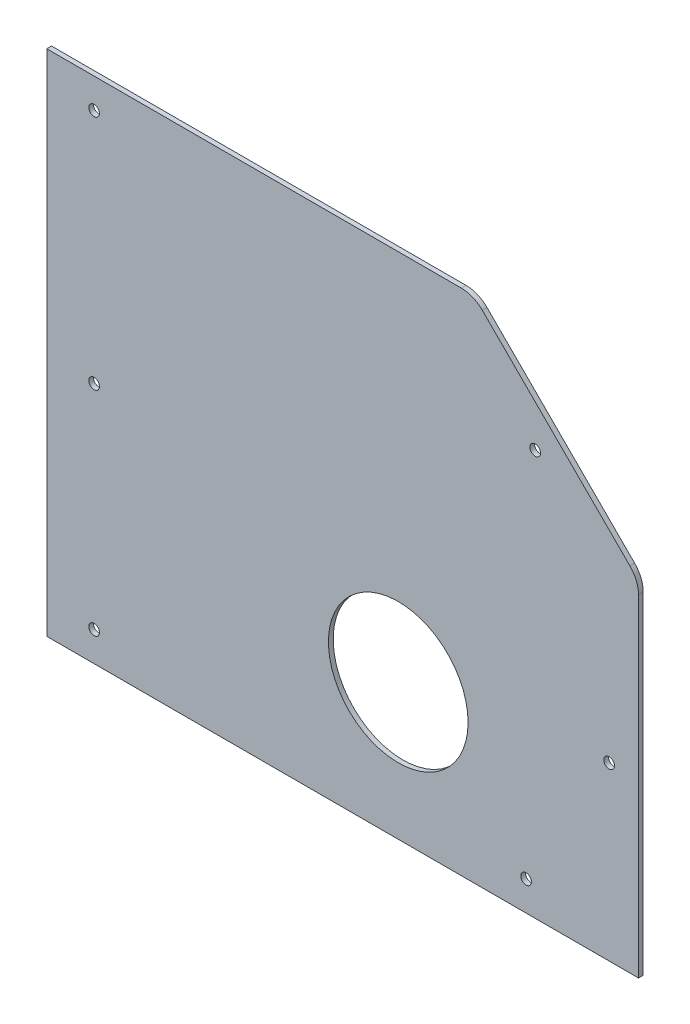
ISO-10303-21;
HEADER;
FILE_DESCRIPTION(('STEP AP214'),'2;1');
FILE_NAME('part.step','',(''),(''),'','','');
FILE_SCHEMA(('AUTOMOTIVE_DESIGN { 1 0 10303 214 1 1 1 1 }'));
ENDSEC;
DATA;
#1=APPLICATION_CONTEXT('core data for automotive mechanical design processes');
#2=APPLICATION_PROTOCOL_DEFINITION('international standard','automotive_design',2000,#1);
#3=PRODUCT_CONTEXT('',#1,'mechanical');
#4=PRODUCT('Part','Part','',(#3));
#5=PRODUCT_RELATED_PRODUCT_CATEGORY('part','',(#4));
#6=PRODUCT_DEFINITION_FORMATION('','',#4);
#7=PRODUCT_DEFINITION_CONTEXT('part definition',#1,'design');
#8=PRODUCT_DEFINITION('design','',#6,#7);
#9=PRODUCT_DEFINITION_SHAPE('','',#8);
#10=(LENGTH_UNIT() NAMED_UNIT(*) SI_UNIT(.MILLI.,.METRE.));
#11=(NAMED_UNIT(*) PLANE_ANGLE_UNIT() SI_UNIT($,.RADIAN.));
#12=(NAMED_UNIT(*) SI_UNIT($,.STERADIAN.) SOLID_ANGLE_UNIT());
#13=UNCERTAINTY_MEASURE_WITH_UNIT(LENGTH_MEASURE(1.E-05),#10,'distance_accuracy_value','');
#14=(GEOMETRIC_REPRESENTATION_CONTEXT(3) GLOBAL_UNCERTAINTY_ASSIGNED_CONTEXT((#13)) GLOBAL_UNIT_ASSIGNED_CONTEXT((#10,
#11,#12)) REPRESENTATION_CONTEXT('',''));
#15=CARTESIAN_POINT('',(0.,0.,0.));
#16=DIRECTION('',(0.,0.,1.));
#17=DIRECTION('',(1.,0.,0.));
#18=AXIS2_PLACEMENT_3D('',#15,#16,#17);
#19=CARTESIAN_POINT('',(-27.4222013243281,-109.999999999997,0.));
#20=DIRECTION('',(0.,0.,1.));
#21=DIRECTION('',(1.,0.,0.));
#22=AXIS2_PLACEMENT_3D('',#19,#20,#21);
#23=PLANE('',#22);
#24=CARTESIAN_POINT('',(-132.422201324328,-205.,0.));
#25=DIRECTION('',(0.,0.,-1.));
#26=DIRECTION('',(-1.,0.,0.));
#27=AXIS2_PLACEMENT_3D('',#24,#25,#26);
#28=CIRCLE('',#27,2.25);
#29=CARTESIAN_POINT('',(-130.172201324328,-205.,0.));
#30=VERTEX_POINT('',#29);
#31=EDGE_CURVE('E146',#30,#30,#28,.T.);
#32=ORIENTED_EDGE('',*,*,#31,.F.);
#33=EDGE_LOOP('',(#32));
#34=FACE_BOUND('',#33,.T.);
#35=CARTESIAN_POINT('',(50.0777986756719,-205.,0.));
#36=DIRECTION('',(0.,0.,-1.));
#37=DIRECTION('',(-1.,0.,0.));
#38=AXIS2_PLACEMENT_3D('',#35,#36,#37);
#39=CIRCLE('',#38,2.25);
#40=CARTESIAN_POINT('',(52.3277986756719,-205.,0.));
#41=VERTEX_POINT('',#40);
#42=EDGE_CURVE('E195',#41,#41,#39,.T.);
#43=ORIENTED_EDGE('',*,*,#42,.F.);
#44=EDGE_LOOP('',(#43));
#45=FACE_BOUND('',#44,.T.);
#46=CARTESIAN_POINT('',(-132.422201324328,-15.0939113089667,0.));
#47=DIRECTION('',(0.,0.,-1.));
#48=DIRECTION('',(-1.,0.,0.));
#49=AXIS2_PLACEMENT_3D('',#46,#47,#48);
#50=CIRCLE('',#49,2.25);
#51=CARTESIAN_POINT('',(-130.172201324328,-15.0939113089667,0.));
#52=VERTEX_POINT('',#51);
#53=EDGE_CURVE('E279',#52,#52,#50,.T.);
#54=ORIENTED_EDGE('',*,*,#53,.F.);
#55=EDGE_LOOP('',(#54));
#56=FACE_BOUND('',#55,.T.);
#57=CARTESIAN_POINT('',(53.9221084670488,-46.1836086897215,0.));
#58=DIRECTION('',(0.,0.,-1.));
#59=DIRECTION('',(-1.,0.,0.));
#60=AXIS2_PLACEMENT_3D('',#57,#58,#59);
#61=CIRCLE('',#60,2.25);
#62=CARTESIAN_POINT('',(56.1721084670488,-46.1836086897215,0.));
#63=VERTEX_POINT('',#62);
#64=EDGE_CURVE('E120',#63,#63,#61,.T.);
#65=ORIENTED_EDGE('',*,*,#64,.F.);
#66=EDGE_LOOP('',(#65));
#67=FACE_BOUND('',#66,.T.);
#68=CARTESIAN_POINT('',(-132.422201324328,-115.,0.));
#69=DIRECTION('',(0.,0.,-1.));
#70=DIRECTION('',(-1.,0.,0.));
#71=AXIS2_PLACEMENT_3D('',#68,#69,#70);
#72=CIRCLE('',#71,2.25);
#73=CARTESIAN_POINT('',(-130.172201324328,-115.,0.));
#74=VERTEX_POINT('',#73);
#75=EDGE_CURVE('E179',#74,#74,#72,.T.);
#76=ORIENTED_EDGE('',*,*,#75,.F.);
#77=EDGE_LOOP('',(#76));
#78=FACE_BOUND('',#77,.T.);
#79=CARTESIAN_POINT('',(-3.92220132432799,-160.,0.));
#80=DIRECTION('',(0.,0.,-1.));
#81=DIRECTION('',(-1.,0.,0.));
#82=AXIS2_PLACEMENT_3D('',#79,#80,#81);
#83=CIRCLE('',#82,29.5);
#84=CARTESIAN_POINT('',(25.577798675672,-160.,0.));
#85=VERTEX_POINT('',#84);
#86=EDGE_CURVE('E207',#85,#85,#83,.T.);
#87=ORIENTED_EDGE('',*,*,#86,.F.);
#88=EDGE_LOOP('',(#87));
#89=FACE_BOUND('',#88,.T.);
#90=CARTESIAN_POINT('',(85.1717099846429,-145.,0.));
#91=DIRECTION('',(0.,0.,-1.));
#92=DIRECTION('',(-1.,0.,0.));
#93=AXIS2_PLACEMENT_3D('',#90,#91,#92);
#94=CIRCLE('',#93,2.25);
#95=CARTESIAN_POINT('',(87.4217099846429,-145.,0.));
#96=VERTEX_POINT('',#95);
#97=EDGE_CURVE('E189',#96,#96,#94,.T.);
#98=ORIENTED_EDGE('',*,*,#97,.F.);
#99=EDGE_LOOP('',(#98));
#100=FACE_BOUND('',#99,.T.);
#101=DIRECTION('',(-1.,0.,0.));
#102=VECTOR('',#101,1.);
#103=CARTESIAN_POINT('',(22.6996581608176,-2.49999999999491,0.));
#104=LINE('',#103,#102);
#105=CARTESIAN_POINT('',(22.6996581608176,-2.49999999999491,0.));
#106=VERTEX_POINT('',#105);
#107=CARTESIAN_POINT('',(-152.422201324328,-2.49999999999474,0.));
#108=VERTEX_POINT('',#107);
#109=EDGE_CURVE('E26',#106,#108,#104,.T.);
#110=ORIENTED_EDGE('',*,*,#109,.F.);
#111=CARTESIAN_POINT('',(22.6996581608177,-15.0939113089667,0.));
#112=DIRECTION('',(0.,0.,1.));
#113=DIRECTION('',(0.707106781186548,0.707106781186547,0.));
#114=AXIS2_PLACEMENT_3D('',#111,#112,#113);
#115=CIRCLE('',#114,12.5939113089718);
#116=CARTESIAN_POINT('',(31.6048982490536,-6.18867122073081,0.));
#117=VERTEX_POINT('',#116);
#118=EDGE_CURVE('E173',#117,#106,#115,.T.);
#119=ORIENTED_EDGE('',*,*,#118,.F.);
#120=DIRECTION('',(-0.707106781186544,0.707106781186551,0.));
#121=VECTOR('',#120,1.);
#122=CARTESIAN_POINT('',(93.9441394260712,-68.5279123977498,0.));
#123=LINE('',#122,#121);
#124=CARTESIAN_POINT('',(93.9441394260712,-68.5279123977498,0.));
#125=VERTEX_POINT('',#124);
#126=EDGE_CURVE('E212',#125,#117,#123,.T.);
#127=ORIENTED_EDGE('',*,*,#126,.F.);
#128=CARTESIAN_POINT('',(85.1717099846428,-77.3003418391783,0.));
#129=DIRECTION('',(0.,0.,1.));
#130=DIRECTION('',(1.,0.,0.));
#131=AXIS2_PLACEMENT_3D('',#128,#129,#130);
#132=CIRCLE('',#131,12.4060886910291);
#133=CARTESIAN_POINT('',(97.5777986756719,-77.3003418391783,0.));
#134=VERTEX_POINT('',#133);
#135=EDGE_CURVE('E203',#134,#125,#132,.T.);
#136=ORIENTED_EDGE('',*,*,#135,.F.);
#137=DIRECTION('',(0.,1.,0.));
#138=VECTOR('',#137,1.);
#139=CARTESIAN_POINT('',(97.5777986756719,-217.5,0.));
#140=LINE('',#139,#138);
#141=CARTESIAN_POINT('',(97.5777986756719,-217.5,0.));
#142=VERTEX_POINT('',#141);
#143=EDGE_CURVE('E184',#142,#134,#140,.T.);
#144=ORIENTED_EDGE('',*,*,#143,.F.);
#145=DIRECTION('',(1.,0.,0.));
#146=VECTOR('',#145,1.);
#147=CARTESIAN_POINT('',(-619.922201324328,-217.5,0.));
#148=LINE('',#147,#146);
#149=CARTESIAN_POINT('',(-152.422201324328,-217.5,0.));
#150=VERTEX_POINT('',#149);
#151=EDGE_CURVE('E240',#150,#142,#148,.T.);
#152=ORIENTED_EDGE('',*,*,#151,.F.);
#153=DIRECTION('',(0.,-1.,0.));
#154=VECTOR('',#153,1.);
#155=CARTESIAN_POINT('',(-152.422201324328,-2.49999999999474,0.));
#156=LINE('',#155,#154);
#157=EDGE_CURVE('E271',#108,#150,#156,.T.);
#158=ORIENTED_EDGE('',*,*,#157,.F.);
#159=EDGE_LOOP('',(#110,#119,#127,#136,#144,#152,#158));
#160=FACE_BOUND('',#159,.T.);
#161=ADVANCED_FACE('F15',(#34,#45,#56,#67,#78,#89,#100,#160),#23,.F.);
#162=CARTESIAN_POINT('',(-27.4222013243281,-109.999999999997,2.));
#163=DIRECTION('',(0.,0.,1.));
#164=DIRECTION('',(1.,0.,0.));
#165=AXIS2_PLACEMENT_3D('',#162,#163,#164);
#166=PLANE('',#165);
#167=CARTESIAN_POINT('',(-132.422201324328,-205.,2.));
#168=DIRECTION('',(0.,0.,-1.));
#169=DIRECTION('',(-1.,0.,0.));
#170=AXIS2_PLACEMENT_3D('',#167,#168,#169);
#171=CIRCLE('',#170,2.25);
#172=CARTESIAN_POINT('',(-130.172201324328,-205.,2.));
#173=VERTEX_POINT('',#172);
#174=EDGE_CURVE('E153',#173,#173,#171,.T.);
#175=ORIENTED_EDGE('',*,*,#174,.T.);
#176=EDGE_LOOP('',(#175));
#177=FACE_BOUND('',#176,.T.);
#178=CARTESIAN_POINT('',(50.0777986756719,-205.,2.));
#179=DIRECTION('',(0.,0.,-1.));
#180=DIRECTION('',(-1.,0.,0.));
#181=AXIS2_PLACEMENT_3D('',#178,#179,#180);
#182=CIRCLE('',#181,2.25);
#183=CARTESIAN_POINT('',(52.3277986756719,-205.,2.));
#184=VERTEX_POINT('',#183);
#185=EDGE_CURVE('E190',#184,#184,#182,.T.);
#186=ORIENTED_EDGE('',*,*,#185,.T.);
#187=EDGE_LOOP('',(#186));
#188=FACE_BOUND('',#187,.T.);
#189=CARTESIAN_POINT('',(-132.422201324328,-15.0939113089667,2.));
#190=DIRECTION('',(0.,0.,-1.));
#191=DIRECTION('',(-1.,0.,0.));
#192=AXIS2_PLACEMENT_3D('',#189,#190,#191);
#193=CIRCLE('',#192,2.25);
#194=CARTESIAN_POINT('',(-130.172201324328,-15.0939113089667,2.));
#195=VERTEX_POINT('',#194);
#196=EDGE_CURVE('E198',#195,#195,#193,.T.);
#197=ORIENTED_EDGE('',*,*,#196,.T.);
#198=EDGE_LOOP('',(#197));
#199=FACE_BOUND('',#198,.T.);
#200=CARTESIAN_POINT('',(53.9221084670488,-46.1836086897215,2.));
#201=DIRECTION('',(0.,0.,-1.));
#202=DIRECTION('',(-1.,0.,0.));
#203=AXIS2_PLACEMENT_3D('',#200,#201,#202);
#204=CIRCLE('',#203,2.25);
#205=CARTESIAN_POINT('',(56.1721084670488,-46.1836086897215,2.));
#206=VERTEX_POINT('',#205);
#207=EDGE_CURVE('E282',#206,#206,#204,.T.);
#208=ORIENTED_EDGE('',*,*,#207,.T.);
#209=EDGE_LOOP('',(#208));
#210=FACE_BOUND('',#209,.T.);
#211=CARTESIAN_POINT('',(-132.422201324328,-115.,2.));
#212=DIRECTION('',(0.,0.,-1.));
#213=DIRECTION('',(-1.,0.,0.));
#214=AXIS2_PLACEMENT_3D('',#211,#212,#213);
#215=CIRCLE('',#214,2.25);
#216=CARTESIAN_POINT('',(-130.172201324328,-115.,2.));
#217=VERTEX_POINT('',#216);
#218=EDGE_CURVE('E247',#217,#217,#215,.T.);
#219=ORIENTED_EDGE('',*,*,#218,.T.);
#220=EDGE_LOOP('',(#219));
#221=FACE_BOUND('',#220,.T.);
#222=CARTESIAN_POINT('',(-3.92220132432799,-160.,2.));
#223=DIRECTION('',(0.,0.,-1.));
#224=DIRECTION('',(-1.,0.,0.));
#225=AXIS2_PLACEMENT_3D('',#222,#223,#224);
#226=CIRCLE('',#225,29.5);
#227=CARTESIAN_POINT('',(25.577798675672,-160.,2.));
#228=VERTEX_POINT('',#227);
#229=EDGE_CURVE('E174',#228,#228,#226,.T.);
#230=ORIENTED_EDGE('',*,*,#229,.T.);
#231=EDGE_LOOP('',(#230));
#232=FACE_BOUND('',#231,.T.);
#233=CARTESIAN_POINT('',(85.1717099846429,-145.,2.));
#234=DIRECTION('',(0.,0.,-1.));
#235=DIRECTION('',(-1.,0.,0.));
#236=AXIS2_PLACEMENT_3D('',#233,#234,#235);
#237=CIRCLE('',#236,2.25);
#238=CARTESIAN_POINT('',(87.4217099846429,-145.,2.));
#239=VERTEX_POINT('',#238);
#240=EDGE_CURVE('E166',#239,#239,#237,.T.);
#241=ORIENTED_EDGE('',*,*,#240,.T.);
#242=EDGE_LOOP('',(#241));
#243=FACE_BOUND('',#242,.T.);
#244=DIRECTION('',(-1.,0.,0.));
#245=VECTOR('',#244,1.);
#246=CARTESIAN_POINT('',(22.6996581608176,-2.49999999999491,2.));
#247=LINE('',#246,#245);
#248=CARTESIAN_POINT('',(22.6996581608176,-2.49999999999491,2.));
#249=VERTEX_POINT('',#248);
#250=CARTESIAN_POINT('',(-152.422201324328,-2.49999999999474,2.));
#251=VERTEX_POINT('',#250);
#252=EDGE_CURVE('E10',#249,#251,#247,.T.);
#253=ORIENTED_EDGE('',*,*,#252,.T.);
#254=DIRECTION('',(0.,-1.,0.));
#255=VECTOR('',#254,1.);
#256=CARTESIAN_POINT('',(-152.422201324328,-2.49999999999474,2.));
#257=LINE('',#256,#255);
#258=CARTESIAN_POINT('',(-152.422201324328,-217.5,2.));
#259=VERTEX_POINT('',#258);
#260=EDGE_CURVE('E268',#251,#259,#257,.T.);
#261=ORIENTED_EDGE('',*,*,#260,.T.);
#262=DIRECTION('',(1.,0.,0.));
#263=VECTOR('',#262,1.);
#264=CARTESIAN_POINT('',(-619.922201324328,-217.5,2.));
#265=LINE('',#264,#263);
#266=CARTESIAN_POINT('',(97.5777986756719,-217.5,2.));
#267=VERTEX_POINT('',#266);
#268=EDGE_CURVE('E261',#259,#267,#265,.T.);
#269=ORIENTED_EDGE('',*,*,#268,.T.);
#270=DIRECTION('',(0.,1.,0.));
#271=VECTOR('',#270,1.);
#272=CARTESIAN_POINT('',(97.5777986756719,-217.5,2.));
#273=LINE('',#272,#271);
#274=CARTESIAN_POINT('',(97.5777986756719,-77.3003418391783,2.));
#275=VERTEX_POINT('',#274);
#276=EDGE_CURVE('E241',#267,#275,#273,.T.);
#277=ORIENTED_EDGE('',*,*,#276,.T.);
#278=CARTESIAN_POINT('',(85.1717099846428,-77.3003418391783,2.));
#279=DIRECTION('',(0.,0.,1.));
#280=DIRECTION('',(1.,0.,0.));
#281=AXIS2_PLACEMENT_3D('',#278,#279,#280);
#282=CIRCLE('',#281,12.4060886910291);
#283=CARTESIAN_POINT('',(93.9441394260712,-68.5279123977498,2.));
#284=VERTEX_POINT('',#283);
#285=EDGE_CURVE('E185',#275,#284,#282,.T.);
#286=ORIENTED_EDGE('',*,*,#285,.T.);
#287=DIRECTION('',(-0.707106781186544,0.707106781186551,0.));
#288=VECTOR('',#287,1.);
#289=CARTESIAN_POINT('',(93.9441394260712,-68.5279123977498,2.));
#290=LINE('',#289,#288);
#291=CARTESIAN_POINT('',(31.6048982490536,-6.18867122073081,2.));
#292=VERTEX_POINT('',#291);
#293=EDGE_CURVE('E210',#284,#292,#290,.T.);
#294=ORIENTED_EDGE('',*,*,#293,.T.);
#295=CARTESIAN_POINT('',(22.6996581608177,-15.0939113089667,2.));
#296=DIRECTION('',(0.,0.,1.));
#297=DIRECTION('',(0.707106781186548,0.707106781186547,0.));
#298=AXIS2_PLACEMENT_3D('',#295,#296,#297);
#299=CIRCLE('',#298,12.5939113089718);
#300=EDGE_CURVE('E172',#292,#249,#299,.T.);
#301=ORIENTED_EDGE('',*,*,#300,.T.);
#302=EDGE_LOOP('',(#253,#261,#269,#277,#286,#294,#301));
#303=FACE_BOUND('',#302,.T.);
#304=ADVANCED_FACE('F157',(#177,#188,#199,#210,#221,#232,#243,#303),#166,.T.);
#305=CARTESIAN_POINT('',(22.6996581608176,-2.49999999999491,0.));
#306=DIRECTION('',(0.,1.,0.));
#307=DIRECTION('',(1.,0.,0.));
#308=AXIS2_PLACEMENT_3D('',#305,#306,#307);
#309=PLANE('',#308);
#310=ORIENTED_EDGE('',*,*,#109,.T.);
#311=DIRECTION('',(0.,0.,1.));
#312=VECTOR('',#311,1.);
#313=CARTESIAN_POINT('',(-152.422201324328,-2.49999999999474,0.));
#314=LINE('',#313,#312);
#315=EDGE_CURVE('E19',#108,#251,#314,.T.);
#316=ORIENTED_EDGE('',*,*,#315,.T.);
#317=ORIENTED_EDGE('',*,*,#252,.F.);
#318=DIRECTION('',(0.,0.,1.));
#319=VECTOR('',#318,1.);
#320=CARTESIAN_POINT('',(22.6996581608176,-2.49999999999491,0.));
#321=LINE('',#320,#319);
#322=EDGE_CURVE('E168',#106,#249,#321,.T.);
#323=ORIENTED_EDGE('',*,*,#322,.F.);
#324=EDGE_LOOP('',(#310,#316,#317,#323));
#325=FACE_BOUND('',#324,.T.);
#326=ADVANCED_FACE('F307',(#325),#309,.T.);
#327=CARTESIAN_POINT('',(-152.422201324328,-2.49999999999474,0.));
#328=DIRECTION('',(-1.,0.,0.));
#329=DIRECTION('',(0.,0.,1.));
#330=AXIS2_PLACEMENT_3D('',#327,#328,#329);
#331=PLANE('',#330);
#332=ORIENTED_EDGE('',*,*,#157,.T.);
#333=DIRECTION('',(0.,0.,1.));
#334=VECTOR('',#333,1.);
#335=CARTESIAN_POINT('',(-152.422201324328,-217.5,0.));
#336=LINE('',#335,#334);
#337=EDGE_CURVE('E265',#150,#259,#336,.T.);
#338=ORIENTED_EDGE('',*,*,#337,.T.);
#339=ORIENTED_EDGE('',*,*,#260,.F.);
#340=ORIENTED_EDGE('',*,*,#315,.F.);
#341=EDGE_LOOP('',(#332,#338,#339,#340));
#342=FACE_BOUND('',#341,.T.);
#343=ADVANCED_FACE('F428',(#342),#331,.T.);
#344=CARTESIAN_POINT('',(-152.422201324328,-217.5,0.));
#345=DIRECTION('',(0.,-1.,0.));
#346=DIRECTION('',(0.,0.,-1.));
#347=AXIS2_PLACEMENT_3D('',#344,#345,#346);
#348=PLANE('',#347);
#349=ORIENTED_EDGE('',*,*,#151,.T.);
#350=DIRECTION('',(0.,0.,1.));
#351=VECTOR('',#350,1.);
#352=CARTESIAN_POINT('',(97.5777986756719,-217.5,0.));
#353=LINE('',#352,#351);
#354=EDGE_CURVE('E236',#142,#267,#353,.T.);
#355=ORIENTED_EDGE('',*,*,#354,.T.);
#356=ORIENTED_EDGE('',*,*,#268,.F.);
#357=ORIENTED_EDGE('',*,*,#337,.F.);
#358=EDGE_LOOP('',(#349,#355,#356,#357));
#359=FACE_BOUND('',#358,.T.);
#360=ADVANCED_FACE('F17',(#359),#348,.T.);
#361=CARTESIAN_POINT('',(97.5777986756719,-217.5,0.));
#362=DIRECTION('',(1.,0.,0.));
#363=DIRECTION('',(0.,1.,0.));
#364=AXIS2_PLACEMENT_3D('',#361,#362,#363);
#365=PLANE('',#364);
#366=ORIENTED_EDGE('',*,*,#143,.T.);
#367=DIRECTION('',(0.,0.,1.));
#368=VECTOR('',#367,1.);
#369=CARTESIAN_POINT('',(97.5777986756719,-77.3003418391783,0.));
#370=LINE('',#369,#368);
#371=EDGE_CURVE('E180',#134,#275,#370,.T.);
#372=ORIENTED_EDGE('',*,*,#371,.T.);
#373=ORIENTED_EDGE('',*,*,#276,.F.);
#374=ORIENTED_EDGE('',*,*,#354,.F.);
#375=EDGE_LOOP('',(#366,#372,#373,#374));
#376=FACE_BOUND('',#375,.T.);
#377=ADVANCED_FACE('F427',(#376),#365,.T.);
#378=CARTESIAN_POINT('',(85.1717099846428,-77.3003418391783,0.));
#379=DIRECTION('',(0.,0.,1.));
#380=DIRECTION('',(1.,0.,0.));
#381=AXIS2_PLACEMENT_3D('',#378,#379,#380);
#382=CYLINDRICAL_SURFACE('',#381,12.4060886910291);
#383=ORIENTED_EDGE('',*,*,#135,.T.);
#384=DIRECTION('',(0.,0.,1.));
#385=VECTOR('',#384,1.);
#386=CARTESIAN_POINT('',(93.9441394260712,-68.5279123977498,0.));
#387=LINE('',#386,#385);
#388=EDGE_CURVE('E206',#125,#284,#387,.T.);
#389=ORIENTED_EDGE('',*,*,#388,.T.);
#390=ORIENTED_EDGE('',*,*,#285,.F.);
#391=ORIENTED_EDGE('',*,*,#371,.F.);
#392=EDGE_LOOP('',(#383,#389,#390,#391));
#393=FACE_BOUND('',#392,.T.);
#394=ADVANCED_FACE('F469',(#393),#382,.T.);
#395=CARTESIAN_POINT('',(93.9441394260712,-68.5279123977498,0.));
#396=DIRECTION('',(0.707106781186551,0.707106781186544,0.));
#397=DIRECTION('',(0.,0.,-1.));
#398=AXIS2_PLACEMENT_3D('',#395,#396,#397);
#399=PLANE('',#398);
#400=ORIENTED_EDGE('',*,*,#126,.T.);
#401=DIRECTION('',(0.,0.,1.));
#402=VECTOR('',#401,1.);
#403=CARTESIAN_POINT('',(31.6048982490536,-6.18867122073081,0.));
#404=LINE('',#403,#402);
#405=EDGE_CURVE('E222',#117,#292,#404,.T.);
#406=ORIENTED_EDGE('',*,*,#405,.T.);
#407=ORIENTED_EDGE('',*,*,#293,.F.);
#408=ORIENTED_EDGE('',*,*,#388,.F.);
#409=EDGE_LOOP('',(#400,#406,#407,#408));
#410=FACE_BOUND('',#409,.T.);
#411=ADVANCED_FACE('F460',(#410),#399,.T.);
#412=CARTESIAN_POINT('',(22.6996581608177,-15.0939113089667,0.));
#413=DIRECTION('',(0.,0.,1.));
#414=DIRECTION('',(0.707106781186548,0.707106781186547,0.));
#415=AXIS2_PLACEMENT_3D('',#412,#413,#414);
#416=CYLINDRICAL_SURFACE('',#415,12.5939113089718);
#417=ORIENTED_EDGE('',*,*,#118,.T.);
#418=ORIENTED_EDGE('',*,*,#322,.T.);
#419=ORIENTED_EDGE('',*,*,#300,.F.);
#420=ORIENTED_EDGE('',*,*,#405,.F.);
#421=EDGE_LOOP('',(#417,#418,#419,#420));
#422=FACE_BOUND('',#421,.T.);
#423=ADVANCED_FACE('F455',(#422),#416,.T.);
#424=CARTESIAN_POINT('',(85.1717099846429,-145.,0.));
#425=DIRECTION('',(0.,0.,1.));
#426=DIRECTION('',(-1.,0.,0.));
#427=AXIS2_PLACEMENT_3D('',#424,#425,#426);
#428=CYLINDRICAL_SURFACE('',#427,2.25);
#429=ORIENTED_EDGE('',*,*,#240,.F.);
#430=DIRECTION('',(0.,0.,-1.));
#431=VECTOR('',#430,1.);
#432=CARTESIAN_POINT('',(87.4217099846429,-145.,0.));
#433=LINE('',#432,#431);
#434=EDGE_CURVE('E255',#239,#96,#433,.T.);
#435=ORIENTED_EDGE('',*,*,#434,.T.);
#436=ORIENTED_EDGE('',*,*,#97,.T.);
#437=ORIENTED_EDGE('',*,*,#434,.F.);
#438=EDGE_LOOP('',(#429,#435,#436,#437));
#439=FACE_BOUND('',#438,.T.);
#440=ADVANCED_FACE('F459',(#439),#428,.F.);
#441=CARTESIAN_POINT('',(-3.92220132432799,-160.,0.));
#442=DIRECTION('',(0.,0.,1.));
#443=DIRECTION('',(-1.,0.,0.));
#444=AXIS2_PLACEMENT_3D('',#441,#442,#443);
#445=CYLINDRICAL_SURFACE('',#444,29.5);
#446=ORIENTED_EDGE('',*,*,#229,.F.);
#447=DIRECTION('',(0.,0.,-1.));
#448=VECTOR('',#447,1.);
#449=CARTESIAN_POINT('',(25.577798675672,-160.,0.));
#450=LINE('',#449,#448);
#451=EDGE_CURVE('E178',#228,#85,#450,.T.);
#452=ORIENTED_EDGE('',*,*,#451,.T.);
#453=ORIENTED_EDGE('',*,*,#86,.T.);
#454=ORIENTED_EDGE('',*,*,#451,.F.);
#455=EDGE_LOOP('',(#446,#452,#453,#454));
#456=FACE_BOUND('',#455,.T.);
#457=ADVANCED_FACE('F499',(#456),#445,.F.);
#458=CARTESIAN_POINT('',(-132.422201324328,-115.,0.));
#459=DIRECTION('',(0.,0.,1.));
#460=DIRECTION('',(-1.,0.,0.));
#461=AXIS2_PLACEMENT_3D('',#458,#459,#460);
#462=CYLINDRICAL_SURFACE('',#461,2.25);
#463=ORIENTED_EDGE('',*,*,#218,.F.);
#464=DIRECTION('',(0.,0.,-1.));
#465=VECTOR('',#464,1.);
#466=CARTESIAN_POINT('',(-130.172201324328,-115.,0.));
#467=LINE('',#466,#465);
#468=EDGE_CURVE('E106',#217,#74,#467,.T.);
#469=ORIENTED_EDGE('',*,*,#468,.T.);
#470=ORIENTED_EDGE('',*,*,#75,.T.);
#471=ORIENTED_EDGE('',*,*,#468,.F.);
#472=EDGE_LOOP('',(#463,#469,#470,#471));
#473=FACE_BOUND('',#472,.T.);
#474=ADVANCED_FACE('F445',(#473),#462,.F.);
#475=CARTESIAN_POINT('',(53.9221084670488,-46.1836086897215,0.));
#476=DIRECTION('',(0.,0.,1.));
#477=DIRECTION('',(-1.,0.,0.));
#478=AXIS2_PLACEMENT_3D('',#475,#476,#477);
#479=CYLINDRICAL_SURFACE('',#478,2.25);
#480=ORIENTED_EDGE('',*,*,#207,.F.);
#481=DIRECTION('',(0.,0.,-1.));
#482=VECTOR('',#481,1.);
#483=CARTESIAN_POINT('',(56.1721084670488,-46.1836086897215,0.));
#484=LINE('',#483,#482);
#485=EDGE_CURVE('E252',#206,#63,#484,.T.);
#486=ORIENTED_EDGE('',*,*,#485,.T.);
#487=ORIENTED_EDGE('',*,*,#64,.T.);
#488=ORIENTED_EDGE('',*,*,#485,.F.);
#489=EDGE_LOOP('',(#480,#486,#487,#488));
#490=FACE_BOUND('',#489,.T.);
#491=ADVANCED_FACE('F440',(#490),#479,.F.);
#492=CARTESIAN_POINT('',(-132.422201324328,-15.0939113089667,0.));
#493=DIRECTION('',(0.,0.,1.));
#494=DIRECTION('',(-1.,0.,0.));
#495=AXIS2_PLACEMENT_3D('',#492,#493,#494);
#496=CYLINDRICAL_SURFACE('',#495,2.25);
#497=ORIENTED_EDGE('',*,*,#196,.F.);
#498=DIRECTION('',(0.,0.,-1.));
#499=VECTOR('',#498,1.);
#500=CARTESIAN_POINT('',(-130.172201324328,-15.0939113089667,0.));
#501=LINE('',#500,#499);
#502=EDGE_CURVE('E202',#195,#52,#501,.T.);
#503=ORIENTED_EDGE('',*,*,#502,.T.);
#504=ORIENTED_EDGE('',*,*,#53,.T.);
#505=ORIENTED_EDGE('',*,*,#502,.F.);
#506=EDGE_LOOP('',(#497,#503,#504,#505));
#507=FACE_BOUND('',#506,.T.);
#508=ADVANCED_FACE('F444',(#507),#496,.F.);
#509=CARTESIAN_POINT('',(50.0777986756719,-205.,0.));
#510=DIRECTION('',(0.,0.,1.));
#511=DIRECTION('',(-1.,0.,0.));
#512=AXIS2_PLACEMENT_3D('',#509,#510,#511);
#513=CYLINDRICAL_SURFACE('',#512,2.25);
#514=ORIENTED_EDGE('',*,*,#185,.F.);
#515=DIRECTION('',(0.,0.,-1.));
#516=VECTOR('',#515,1.);
#517=CARTESIAN_POINT('',(52.3277986756719,-205.,0.));
#518=LINE('',#517,#516);
#519=EDGE_CURVE('E194',#184,#41,#518,.T.);
#520=ORIENTED_EDGE('',*,*,#519,.T.);
#521=ORIENTED_EDGE('',*,*,#42,.T.);
#522=ORIENTED_EDGE('',*,*,#519,.F.);
#523=EDGE_LOOP('',(#514,#520,#521,#522));
#524=FACE_BOUND('',#523,.T.);
#525=ADVANCED_FACE('F303',(#524),#513,.F.);
#526=CARTESIAN_POINT('',(-132.422201324328,-205.,0.));
#527=DIRECTION('',(0.,0.,1.));
#528=DIRECTION('',(-1.,0.,0.));
#529=AXIS2_PLACEMENT_3D('',#526,#527,#528);
#530=CYLINDRICAL_SURFACE('',#529,2.25);
#531=ORIENTED_EDGE('',*,*,#174,.F.);
#532=DIRECTION('',(0.,0.,-1.));
#533=VECTOR('',#532,1.);
#534=CARTESIAN_POINT('',(-130.172201324328,-205.,0.));
#535=LINE('',#534,#533);
#536=EDGE_CURVE('E150',#173,#30,#535,.T.);
#537=ORIENTED_EDGE('',*,*,#536,.T.);
#538=ORIENTED_EDGE('',*,*,#31,.T.);
#539=ORIENTED_EDGE('',*,*,#536,.F.);
#540=EDGE_LOOP('',(#531,#537,#538,#539));
#541=FACE_BOUND('',#540,.T.);
#542=ADVANCED_FACE('F152',(#541),#530,.F.);
#543=CLOSED_SHELL('',(#161,#304,#326,#343,#360,#377,#394,#411,#423,#440,#457,#474,#491,#508,
#525,#542));
#544=MANIFOLD_SOLID_BREP('B1',#543);
#545=ADVANCED_BREP_SHAPE_REPRESENTATION('',(#18,#544),#14);
#546=SHAPE_DEFINITION_REPRESENTATION(#9,#545);
ENDSEC;
END-ISO-10303-21;
